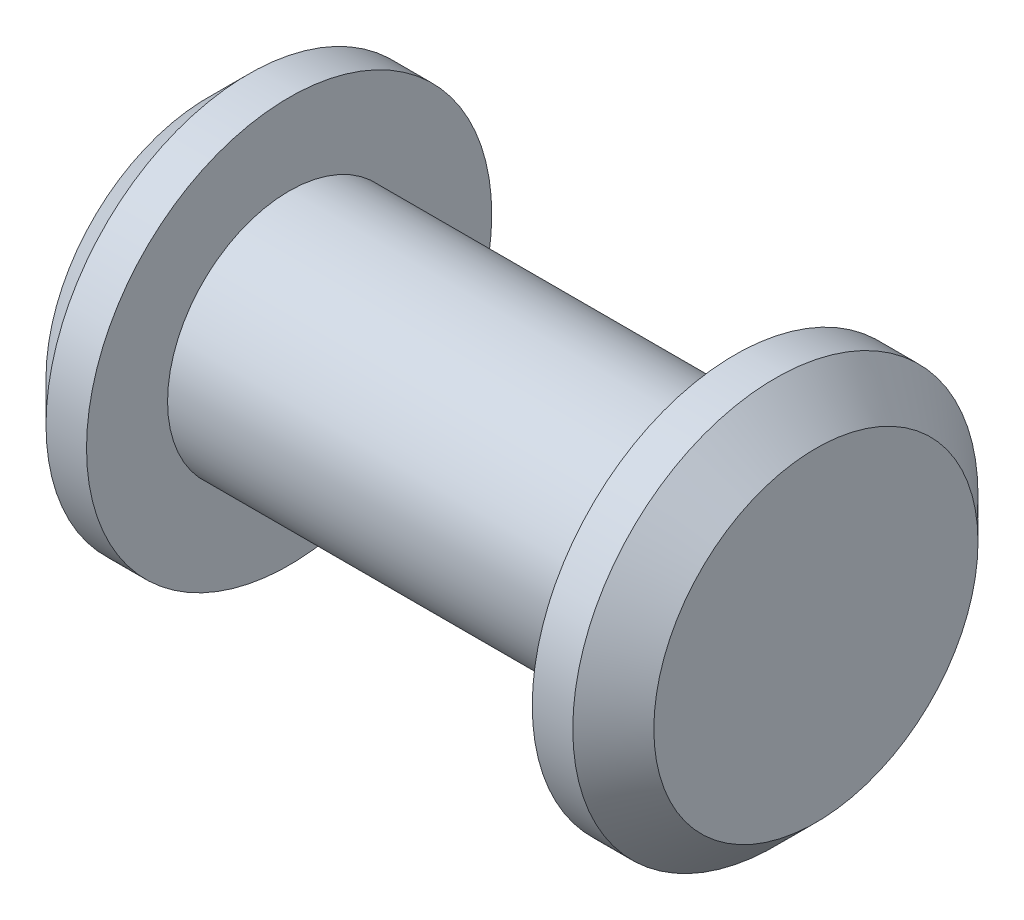
ISO-10303-21;
HEADER;
FILE_DESCRIPTION(('STEP AP214'),'2;1');
FILE_NAME('part.step','',(''),(''),'','','');
FILE_SCHEMA(('AUTOMOTIVE_DESIGN { 1 0 10303 214 1 1 1 1 }'));
ENDSEC;
DATA;
#1=APPLICATION_CONTEXT('core data for automotive mechanical design processes');
#2=APPLICATION_PROTOCOL_DEFINITION('international standard','automotive_design',2000,#1);
#3=PRODUCT_CONTEXT('',#1,'mechanical');
#4=PRODUCT('Part','Part','',(#3));
#5=PRODUCT_RELATED_PRODUCT_CATEGORY('part','',(#4));
#6=PRODUCT_DEFINITION_FORMATION('','',#4);
#7=PRODUCT_DEFINITION_CONTEXT('part definition',#1,'design');
#8=PRODUCT_DEFINITION('design','',#6,#7);
#9=PRODUCT_DEFINITION_SHAPE('','',#8);
#10=(LENGTH_UNIT() NAMED_UNIT(*) SI_UNIT(.MILLI.,.METRE.));
#11=(NAMED_UNIT(*) PLANE_ANGLE_UNIT() SI_UNIT($,.RADIAN.));
#12=(NAMED_UNIT(*) SI_UNIT($,.STERADIAN.) SOLID_ANGLE_UNIT());
#13=UNCERTAINTY_MEASURE_WITH_UNIT(LENGTH_MEASURE(1.E-05),#10,'distance_accuracy_value','');
#14=(GEOMETRIC_REPRESENTATION_CONTEXT(3) GLOBAL_UNCERTAINTY_ASSIGNED_CONTEXT((#13)) GLOBAL_UNIT_ASSIGNED_CONTEXT((#10,
#11,#12)) REPRESENTATION_CONTEXT('',''));
#15=CARTESIAN_POINT('',(0.,0.,0.));
#16=DIRECTION('',(0.,0.,1.));
#17=DIRECTION('',(1.,0.,0.));
#18=AXIS2_PLACEMENT_3D('',#15,#16,#17);
#19=CARTESIAN_POINT('',(15.,0.,0.));
#20=DIRECTION('',(-1.,0.,0.));
#21=DIRECTION('',(0.,0.,1.));
#22=AXIS2_PLACEMENT_3D('',#19,#20,#21);
#23=PLANE('',#22);
#24=CARTESIAN_POINT('',(15.,0.,0.));
#25=DIRECTION('',(-1.,0.,0.));
#26=DIRECTION('',(0.,0.,1.));
#27=AXIS2_PLACEMENT_3D('',#24,#25,#26);
#28=CIRCLE('',#27,8.00000000000001);
#29=CARTESIAN_POINT('',(15.,0.,8.00000000000001));
#30=VERTEX_POINT('',#29);
#31=EDGE_CURVE('E10',#30,#30,#28,.T.);
#32=ORIENTED_EDGE('',*,*,#31,.F.);
#33=EDGE_LOOP('',(#32));
#34=FACE_BOUND('',#33,.T.);
#35=ADVANCED_FACE('F41',(#34),#23,.F.);
#36=CARTESIAN_POINT('',(15.,0.,0.));
#37=DIRECTION('',(-1.,0.,0.));
#38=DIRECTION('',(0.,0.,1.));
#39=AXIS2_PLACEMENT_3D('',#36,#37,#38);
#40=CONICAL_SURFACE('',#39,8.00000000000001,0.785398163397447);
#41=CARTESIAN_POINT('',(13.,0.,0.));
#42=DIRECTION('',(-1.,0.,0.));
#43=DIRECTION('',(0.,0.,1.));
#44=AXIS2_PLACEMENT_3D('',#41,#42,#43);
#45=CIRCLE('',#44,10.);
#46=CARTESIAN_POINT('',(13.,0.,10.));
#47=VERTEX_POINT('',#46);
#48=EDGE_CURVE('E47',#47,#47,#45,.T.);
#49=ORIENTED_EDGE('',*,*,#48,.F.);
#50=EDGE_LOOP('',(#49));
#51=FACE_BOUND('',#50,.T.);
#52=ORIENTED_EDGE('',*,*,#31,.T.);
#53=EDGE_LOOP('',(#52));
#54=FACE_BOUND('',#53,.T.);
#55=ADVANCED_FACE('F107',(#51,#54),#40,.T.);
#56=CARTESIAN_POINT('',(-15.,0.,0.));
#57=DIRECTION('',(-1.,0.,0.));
#58=DIRECTION('',(0.,0.,1.));
#59=AXIS2_PLACEMENT_3D('',#56,#57,#58);
#60=CYLINDRICAL_SURFACE('',#59,10.);
#61=CARTESIAN_POINT('',(11.,0.,0.));
#62=DIRECTION('',(-1.,0.,0.));
#63=DIRECTION('',(0.,0.,1.));
#64=AXIS2_PLACEMENT_3D('',#61,#62,#63);
#65=CIRCLE('',#64,10.);
#66=CARTESIAN_POINT('',(11.,0.,10.));
#67=VERTEX_POINT('',#66);
#68=EDGE_CURVE('E51',#67,#67,#65,.T.);
#69=ORIENTED_EDGE('',*,*,#68,.F.);
#70=EDGE_LOOP('',(#69));
#71=FACE_BOUND('',#70,.T.);
#72=ORIENTED_EDGE('',*,*,#48,.T.);
#73=EDGE_LOOP('',(#72));
#74=FACE_BOUND('',#73,.T.);
#75=ADVANCED_FACE('F102',(#71,#74),#60,.T.);
#76=CARTESIAN_POINT('',(11.,10.,0.));
#77=DIRECTION('',(1.,0.,0.));
#78=DIRECTION('',(0.,0.,-1.));
#79=AXIS2_PLACEMENT_3D('',#76,#77,#78);
#80=PLANE('',#79);
#81=CARTESIAN_POINT('',(11.,0.,0.));
#82=DIRECTION('',(-1.,0.,0.));
#83=DIRECTION('',(0.,0.,1.));
#84=AXIS2_PLACEMENT_3D('',#81,#82,#83);
#85=CIRCLE('',#84,6.);
#86=CARTESIAN_POINT('',(11.,0.,6.));
#87=VERTEX_POINT('',#86);
#88=EDGE_CURVE('E55',#87,#87,#85,.T.);
#89=ORIENTED_EDGE('',*,*,#88,.F.);
#90=EDGE_LOOP('',(#89));
#91=FACE_BOUND('',#90,.T.);
#92=ORIENTED_EDGE('',*,*,#68,.T.);
#93=EDGE_LOOP('',(#92));
#94=FACE_BOUND('',#93,.T.);
#95=ADVANCED_FACE('F96',(#91,#94),#80,.F.);
#96=CARTESIAN_POINT('',(-15.,0.,0.));
#97=DIRECTION('',(-1.,0.,0.));
#98=DIRECTION('',(0.,0.,1.));
#99=AXIS2_PLACEMENT_3D('',#96,#97,#98);
#100=CYLINDRICAL_SURFACE('',#99,6.);
#101=CARTESIAN_POINT('',(-11.,0.,0.));
#102=DIRECTION('',(-1.,0.,0.));
#103=DIRECTION('',(0.,0.,1.));
#104=AXIS2_PLACEMENT_3D('',#101,#102,#103);
#105=CIRCLE('',#104,6.);
#106=CARTESIAN_POINT('',(-11.,0.,6.));
#107=VERTEX_POINT('',#106);
#108=EDGE_CURVE('E60',#107,#107,#105,.T.);
#109=ORIENTED_EDGE('',*,*,#108,.F.);
#110=EDGE_LOOP('',(#109));
#111=FACE_BOUND('',#110,.T.);
#112=ORIENTED_EDGE('',*,*,#88,.T.);
#113=EDGE_LOOP('',(#112));
#114=FACE_BOUND('',#113,.T.);
#115=ADVANCED_FACE('F90',(#111,#114),#100,.T.);
#116=CARTESIAN_POINT('',(-11.,10.,0.));
#117=DIRECTION('',(-1.,0.,0.));
#118=DIRECTION('',(0.,0.,1.));
#119=AXIS2_PLACEMENT_3D('',#116,#117,#118);
#120=PLANE('',#119);
#121=CARTESIAN_POINT('',(-11.,0.,0.));
#122=DIRECTION('',(-1.,0.,0.));
#123=DIRECTION('',(0.,0.,1.));
#124=AXIS2_PLACEMENT_3D('',#121,#122,#123);
#125=CIRCLE('',#124,10.);
#126=CARTESIAN_POINT('',(-11.,0.,10.));
#127=VERTEX_POINT('',#126);
#128=EDGE_CURVE('E63',#127,#127,#125,.T.);
#129=ORIENTED_EDGE('',*,*,#128,.F.);
#130=EDGE_LOOP('',(#129));
#131=FACE_BOUND('',#130,.T.);
#132=ORIENTED_EDGE('',*,*,#108,.T.);
#133=EDGE_LOOP('',(#132));
#134=FACE_BOUND('',#133,.T.);
#135=ADVANCED_FACE('F84',(#131,#134),#120,.F.);
#136=CARTESIAN_POINT('',(-15.,0.,0.));
#137=DIRECTION('',(-1.,0.,0.));
#138=DIRECTION('',(0.,0.,1.));
#139=AXIS2_PLACEMENT_3D('',#136,#137,#138);
#140=CYLINDRICAL_SURFACE('',#139,10.);
#141=CARTESIAN_POINT('',(-13.,0.,0.));
#142=DIRECTION('',(-1.,0.,0.));
#143=DIRECTION('',(0.,0.,1.));
#144=AXIS2_PLACEMENT_3D('',#141,#142,#143);
#145=CIRCLE('',#144,10.);
#146=CARTESIAN_POINT('',(-13.,0.,10.));
#147=VERTEX_POINT('',#146);
#148=EDGE_CURVE('E66',#147,#147,#145,.T.);
#149=ORIENTED_EDGE('',*,*,#148,.F.);
#150=EDGE_LOOP('',(#149));
#151=FACE_BOUND('',#150,.T.);
#152=ORIENTED_EDGE('',*,*,#128,.T.);
#153=EDGE_LOOP('',(#152));
#154=FACE_BOUND('',#153,.T.);
#155=ADVANCED_FACE('F78',(#151,#154),#140,.T.);
#156=CARTESIAN_POINT('',(-13.,0.,0.));
#157=DIRECTION('',(1.,0.,0.));
#158=DIRECTION('',(0.,0.,-1.));
#159=AXIS2_PLACEMENT_3D('',#156,#157,#158);
#160=CONICAL_SURFACE('',#159,10.,0.78539816339745);
#161=CARTESIAN_POINT('',(-15.,0.,0.));
#162=DIRECTION('',(-1.,0.,0.));
#163=DIRECTION('',(0.,0.,1.));
#164=AXIS2_PLACEMENT_3D('',#161,#162,#163);
#165=CIRCLE('',#164,8.);
#166=CARTESIAN_POINT('',(-15.,0.,8.));
#167=VERTEX_POINT('',#166);
#168=EDGE_CURVE('E69',#167,#167,#165,.T.);
#169=ORIENTED_EDGE('',*,*,#168,.F.);
#170=EDGE_LOOP('',(#169));
#171=FACE_BOUND('',#170,.T.);
#172=ORIENTED_EDGE('',*,*,#148,.T.);
#173=EDGE_LOOP('',(#172));
#174=FACE_BOUND('',#173,.T.);
#175=ADVANCED_FACE('F75',(#171,#174),#160,.T.);
#176=CARTESIAN_POINT('',(-15.,0.,0.));
#177=DIRECTION('',(1.,0.,0.));
#178=DIRECTION('',(0.,0.,-1.));
#179=AXIS2_PLACEMENT_3D('',#176,#177,#178);
#180=PLANE('',#179);
#181=ORIENTED_EDGE('',*,*,#168,.T.);
#182=EDGE_LOOP('',(#181));
#183=FACE_BOUND('',#182,.T.);
#184=ADVANCED_FACE('F73',(#183),#180,.F.);
#185=CLOSED_SHELL('',(#35,#55,#75,#95,#115,#135,#155,#175,#184));
#186=MANIFOLD_SOLID_BREP('B2',#185);
#187=ADVANCED_BREP_SHAPE_REPRESENTATION('',(#18,#186),#14);
#188=SHAPE_DEFINITION_REPRESENTATION(#9,#187);
ENDSEC;
END-ISO-10303-21;
